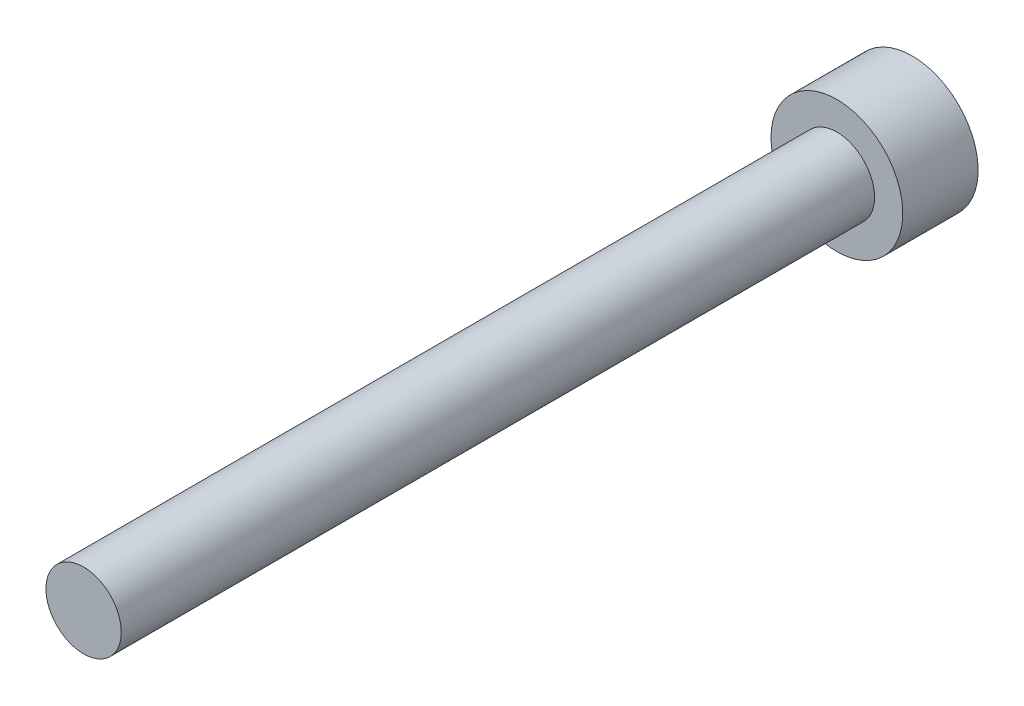
ISO-10303-21;
HEADER;
FILE_DESCRIPTION(('STEP AP214'),'2;1');
FILE_NAME('part.step','',(''),(''),'','','');
FILE_SCHEMA(('AUTOMOTIVE_DESIGN { 1 0 10303 214 1 1 1 1 }'));
ENDSEC;
DATA;
#1=APPLICATION_CONTEXT('core data for automotive mechanical design processes');
#2=APPLICATION_PROTOCOL_DEFINITION('international standard','automotive_design',2000,#1);
#3=PRODUCT_CONTEXT('',#1,'mechanical');
#4=PRODUCT('Part','Part','',(#3));
#5=PRODUCT_RELATED_PRODUCT_CATEGORY('part','',(#4));
#6=PRODUCT_DEFINITION_FORMATION('','',#4);
#7=PRODUCT_DEFINITION_CONTEXT('part definition',#1,'design');
#8=PRODUCT_DEFINITION('design','',#6,#7);
#9=PRODUCT_DEFINITION_SHAPE('','',#8);
#10=(LENGTH_UNIT() NAMED_UNIT(*) SI_UNIT(.MILLI.,.METRE.));
#11=(NAMED_UNIT(*) PLANE_ANGLE_UNIT() SI_UNIT($,.RADIAN.));
#12=(NAMED_UNIT(*) SI_UNIT($,.STERADIAN.) SOLID_ANGLE_UNIT());
#13=UNCERTAINTY_MEASURE_WITH_UNIT(LENGTH_MEASURE(1.E-05),#10,'distance_accuracy_value','');
#14=(GEOMETRIC_REPRESENTATION_CONTEXT(3) GLOBAL_UNCERTAINTY_ASSIGNED_CONTEXT((#13)) GLOBAL_UNIT_ASSIGNED_CONTEXT((#10,
#11,#12)) REPRESENTATION_CONTEXT('',''));
#15=CARTESIAN_POINT('',(0.,0.,0.));
#16=DIRECTION('',(0.,0.,1.));
#17=DIRECTION('',(1.,0.,0.));
#18=AXIS2_PLACEMENT_3D('',#15,#16,#17);
#19=CARTESIAN_POINT('',(3.5,0.,4.));
#20=DIRECTION('',(0.,0.,1.));
#21=DIRECTION('',(1.,0.,0.));
#22=AXIS2_PLACEMENT_3D('',#19,#20,#21);
#23=PLANE('',#22);
#24=CARTESIAN_POINT('',(0.,0.,4.));
#25=DIRECTION('',(0.,0.,-1.));
#26=DIRECTION('',(-1.,0.,0.));
#27=AXIS2_PLACEMENT_3D('',#24,#25,#26);
#28=CIRCLE('',#27,3.5);
#29=CARTESIAN_POINT('',(-3.5,0.,4.));
#30=VERTEX_POINT('',#29);
#31=EDGE_CURVE('E11',#30,#30,#28,.T.);
#32=ORIENTED_EDGE('',*,*,#31,.F.);
#33=EDGE_LOOP('',(#32));
#34=FACE_BOUND('',#33,.T.);
#35=CARTESIAN_POINT('',(0.,0.,4.));
#36=DIRECTION('',(0.,0.,1.));
#37=DIRECTION('',(1.,0.,0.));
#38=AXIS2_PLACEMENT_3D('',#35,#36,#37);
#39=CIRCLE('',#38,2.);
#40=CARTESIAN_POINT('',(2.,0.,4.));
#41=VERTEX_POINT('',#40);
#42=EDGE_CURVE('E140',#41,#41,#39,.T.);
#43=ORIENTED_EDGE('',*,*,#42,.F.);
#44=EDGE_LOOP('',(#43));
#45=FACE_BOUND('',#44,.T.);
#46=ADVANCED_FACE('F30',(#34,#45),#23,.T.);
#47=CARTESIAN_POINT('',(0.,0.,4.));
#48=DIRECTION('',(0.,0.,-1.));
#49=DIRECTION('',(-1.,0.,0.));
#50=AXIS2_PLACEMENT_3D('',#47,#48,#49);
#51=CYLINDRICAL_SURFACE('',#50,3.5);
#52=ORIENTED_EDGE('',*,*,#31,.T.);
#53=EDGE_LOOP('',(#52));
#54=FACE_BOUND('',#53,.T.);
#55=CARTESIAN_POINT('',(0.,0.,0.));
#56=DIRECTION('',(0.,0.,-1.));
#57=DIRECTION('',(-1.,0.,0.));
#58=AXIS2_PLACEMENT_3D('',#55,#56,#57);
#59=CIRCLE('',#58,3.5);
#60=CARTESIAN_POINT('',(-3.5,0.,0.));
#61=VERTEX_POINT('',#60);
#62=EDGE_CURVE('E38',#61,#61,#59,.T.);
#63=ORIENTED_EDGE('',*,*,#62,.F.);
#64=EDGE_LOOP('',(#63));
#65=FACE_BOUND('',#64,.T.);
#66=ADVANCED_FACE('F32',(#54,#65),#51,.T.);
#67=CARTESIAN_POINT('',(0.,0.,0.));
#68=DIRECTION('',(0.,0.,-1.));
#69=DIRECTION('',(-1.,0.,0.));
#70=AXIS2_PLACEMENT_3D('',#67,#68,#69);
#71=PLANE('',#70);
#72=DIRECTION('',(0.5,-0.866025403784439,0.));
#73=VECTOR('',#72,1.);
#74=CARTESIAN_POINT('',(0.850000000000006,1.47224318643355,0.));
#75=LINE('',#74,#73);
#76=CARTESIAN_POINT('',(0.850000000000006,1.47224318643355,0.));
#77=VERTEX_POINT('',#76);
#78=CARTESIAN_POINT('',(1.70000000000001,0.,0.));
#79=VERTEX_POINT('',#78);
#80=EDGE_CURVE('E45',#77,#79,#75,.T.);
#81=ORIENTED_EDGE('',*,*,#80,.F.);
#82=DIRECTION('',(1.,0.,0.));
#83=VECTOR('',#82,1.);
#84=CARTESIAN_POINT('',(-0.849999999999998,1.47224318643355,0.));
#85=LINE('',#84,#83);
#86=CARTESIAN_POINT('',(-0.849999999999998,1.47224318643355,0.));
#87=VERTEX_POINT('',#86);
#88=EDGE_CURVE('E128',#87,#77,#85,.T.);
#89=ORIENTED_EDGE('',*,*,#88,.F.);
#90=DIRECTION('',(0.500000000000001,0.866025403784438,0.));
#91=VECTOR('',#90,1.);
#92=CARTESIAN_POINT('',(-1.7,0.,0.));
#93=LINE('',#92,#91);
#94=CARTESIAN_POINT('',(-1.7,0.,0.));
#95=VERTEX_POINT('',#94);
#96=EDGE_CURVE('E126',#95,#87,#93,.T.);
#97=ORIENTED_EDGE('',*,*,#96,.F.);
#98=DIRECTION('',(-0.499999999999999,0.866025403784439,0.));
#99=VECTOR('',#98,1.);
#100=CARTESIAN_POINT('',(-0.849999999999999,-1.47224318643355,0.));
#101=LINE('',#100,#99);
#102=CARTESIAN_POINT('',(-0.849999999999999,-1.47224318643355,0.));
#103=VERTEX_POINT('',#102);
#104=EDGE_CURVE('E93',#103,#95,#101,.T.);
#105=ORIENTED_EDGE('',*,*,#104,.F.);
#106=DIRECTION('',(-1.,0.,0.));
#107=VECTOR('',#106,1.);
#108=CARTESIAN_POINT('',(0.850000000000003,-1.47224318643355,0.));
#109=LINE('',#108,#107);
#110=CARTESIAN_POINT('',(0.850000000000003,-1.47224318643355,0.));
#111=VERTEX_POINT('',#110);
#112=EDGE_CURVE('E122',#111,#103,#109,.T.);
#113=ORIENTED_EDGE('',*,*,#112,.F.);
#114=DIRECTION('',(-0.500000000000002,-0.866025403784438,0.));
#115=VECTOR('',#114,1.);
#116=CARTESIAN_POINT('',(1.70000000000001,0.,0.));
#117=LINE('',#116,#115);
#118=EDGE_CURVE('E119',#79,#111,#117,.T.);
#119=ORIENTED_EDGE('',*,*,#118,.F.);
#120=EDGE_LOOP('',(#81,#89,#97,#105,#113,#119));
#121=FACE_BOUND('',#120,.T.);
#122=ORIENTED_EDGE('',*,*,#62,.T.);
#123=EDGE_LOOP('',(#122));
#124=FACE_BOUND('',#123,.T.);
#125=ADVANCED_FACE('F145',(#121,#124),#71,.T.);
#126=CARTESIAN_POINT('',(0.,0.,24.));
#127=DIRECTION('',(0.,0.,-1.));
#128=DIRECTION('',(-1.,0.,0.));
#129=AXIS2_PLACEMENT_3D('',#126,#127,#128);
#130=CYLINDRICAL_SURFACE('',#129,2.);
#131=ORIENTED_EDGE('',*,*,#42,.T.);
#132=EDGE_LOOP('',(#131));
#133=FACE_BOUND('',#132,.T.);
#134=CARTESIAN_POINT('',(0.,0.,44.));
#135=DIRECTION('',(0.,0.,1.));
#136=DIRECTION('',(1.,0.,0.));
#137=AXIS2_PLACEMENT_3D('',#134,#135,#136);
#138=CIRCLE('',#137,2.);
#139=CARTESIAN_POINT('',(2.,0.,44.));
#140=VERTEX_POINT('',#139);
#141=EDGE_CURVE('E132',#140,#140,#138,.T.);
#142=ORIENTED_EDGE('',*,*,#141,.F.);
#143=EDGE_LOOP('',(#142));
#144=FACE_BOUND('',#143,.T.);
#145=ADVANCED_FACE('F153',(#133,#144),#130,.T.);
#146=CARTESIAN_POINT('',(0.,0.,44.));
#147=DIRECTION('',(0.,0.,1.));
#148=DIRECTION('',(1.,0.,0.));
#149=AXIS2_PLACEMENT_3D('',#146,#147,#148);
#150=PLANE('',#149);
#151=ORIENTED_EDGE('',*,*,#141,.T.);
#152=EDGE_LOOP('',(#151));
#153=FACE_BOUND('',#152,.T.);
#154=ADVANCED_FACE('F163',(#153),#150,.T.);
#155=CARTESIAN_POINT('',(0.850000000000006,1.47224318643355,2.4));
#156=DIRECTION('',(0.866025403784439,0.5,0.));
#157=DIRECTION('',(-0.5,0.866025403784439,0.));
#158=AXIS2_PLACEMENT_3D('',#155,#156,#157);
#159=PLANE('',#158);
#160=ORIENTED_EDGE('',*,*,#80,.T.);
#161=DIRECTION('',(0.,0.,-1.));
#162=VECTOR('',#161,1.);
#163=CARTESIAN_POINT('',(1.70000000000001,0.,2.4));
#164=LINE('',#163,#162);
#165=CARTESIAN_POINT('',(1.70000000000001,0.,2.4));
#166=VERTEX_POINT('',#165);
#167=EDGE_CURVE('E75',#166,#79,#164,.T.);
#168=ORIENTED_EDGE('',*,*,#167,.F.);
#169=DIRECTION('',(0.5,-0.866025403784439,0.));
#170=VECTOR('',#169,1.);
#171=CARTESIAN_POINT('',(0.850000000000006,1.47224318643355,2.4));
#172=LINE('',#171,#170);
#173=CARTESIAN_POINT('',(0.850000000000006,1.47224318643355,2.4));
#174=VERTEX_POINT('',#173);
#175=EDGE_CURVE('E130',#174,#166,#172,.T.);
#176=ORIENTED_EDGE('',*,*,#175,.F.);
#177=DIRECTION('',(0.,0.,-1.));
#178=VECTOR('',#177,1.);
#179=CARTESIAN_POINT('',(0.850000000000006,1.47224318643355,2.4));
#180=LINE('',#179,#178);
#181=EDGE_CURVE('E53',#174,#77,#180,.T.);
#182=ORIENTED_EDGE('',*,*,#181,.T.);
#183=EDGE_LOOP('',(#160,#168,#176,#182));
#184=FACE_BOUND('',#183,.T.);
#185=ADVANCED_FACE('F168',(#184),#159,.F.);
#186=CARTESIAN_POINT('',(-0.849999999999998,1.47224318643355,2.4));
#187=DIRECTION('',(0.,1.,0.));
#188=DIRECTION('',(-1.,0.,0.));
#189=AXIS2_PLACEMENT_3D('',#186,#187,#188);
#190=PLANE('',#189);
#191=ORIENTED_EDGE('',*,*,#88,.T.);
#192=ORIENTED_EDGE('',*,*,#181,.F.);
#193=DIRECTION('',(1.,0.,0.));
#194=VECTOR('',#193,1.);
#195=CARTESIAN_POINT('',(-0.849999999999998,1.47224318643355,2.4));
#196=LINE('',#195,#194);
#197=CARTESIAN_POINT('',(-0.849999999999998,1.47224318643355,2.4));
#198=VERTEX_POINT('',#197);
#199=EDGE_CURVE('E105',#198,#174,#196,.T.);
#200=ORIENTED_EDGE('',*,*,#199,.F.);
#201=DIRECTION('',(0.,0.,-1.));
#202=VECTOR('',#201,1.);
#203=CARTESIAN_POINT('',(-0.849999999999998,1.47224318643355,2.4));
#204=LINE('',#203,#202);
#205=EDGE_CURVE('E97',#198,#87,#204,.T.);
#206=ORIENTED_EDGE('',*,*,#205,.T.);
#207=EDGE_LOOP('',(#191,#192,#200,#206));
#208=FACE_BOUND('',#207,.T.);
#209=ADVANCED_FACE('F173',(#208),#190,.F.);
#210=CARTESIAN_POINT('',(-1.7,0.,2.4));
#211=DIRECTION('',(-0.866025403784438,0.500000000000001,0.));
#212=DIRECTION('',(-0.500000000000001,-0.866025403784438,0.));
#213=AXIS2_PLACEMENT_3D('',#210,#211,#212);
#214=PLANE('',#213);
#215=ORIENTED_EDGE('',*,*,#96,.T.);
#216=ORIENTED_EDGE('',*,*,#205,.F.);
#217=DIRECTION('',(0.500000000000001,0.866025403784438,0.));
#218=VECTOR('',#217,1.);
#219=CARTESIAN_POINT('',(-1.7,0.,2.4));
#220=LINE('',#219,#218);
#221=CARTESIAN_POINT('',(-1.7,0.,2.4));
#222=VERTEX_POINT('',#221);
#223=EDGE_CURVE('E101',#222,#198,#220,.T.);
#224=ORIENTED_EDGE('',*,*,#223,.F.);
#225=DIRECTION('',(0.,0.,-1.));
#226=VECTOR('',#225,1.);
#227=CARTESIAN_POINT('',(-1.7,0.,2.4));
#228=LINE('',#227,#226);
#229=EDGE_CURVE('E86',#222,#95,#228,.T.);
#230=ORIENTED_EDGE('',*,*,#229,.T.);
#231=EDGE_LOOP('',(#215,#216,#224,#230));
#232=FACE_BOUND('',#231,.T.);
#233=ADVANCED_FACE('F102',(#232),#214,.F.);
#234=CARTESIAN_POINT('',(-0.849999999999999,-1.47224318643355,2.4));
#235=DIRECTION('',(-0.866025403784439,-0.499999999999999,0.));
#236=DIRECTION('',(0.499999999999999,-0.866025403784439,0.));
#237=AXIS2_PLACEMENT_3D('',#234,#235,#236);
#238=PLANE('',#237);
#239=ORIENTED_EDGE('',*,*,#104,.T.);
#240=ORIENTED_EDGE('',*,*,#229,.F.);
#241=DIRECTION('',(-0.499999999999999,0.866025403784439,0.));
#242=VECTOR('',#241,1.);
#243=CARTESIAN_POINT('',(-0.849999999999999,-1.47224318643355,2.4));
#244=LINE('',#243,#242);
#245=CARTESIAN_POINT('',(-0.849999999999999,-1.47224318643355,2.4));
#246=VERTEX_POINT('',#245);
#247=EDGE_CURVE('E90',#246,#222,#244,.T.);
#248=ORIENTED_EDGE('',*,*,#247,.F.);
#249=DIRECTION('',(0.,0.,-1.));
#250=VECTOR('',#249,1.);
#251=CARTESIAN_POINT('',(-0.849999999999999,-1.47224318643355,2.4));
#252=LINE('',#251,#250);
#253=EDGE_CURVE('E98',#246,#103,#252,.T.);
#254=ORIENTED_EDGE('',*,*,#253,.T.);
#255=EDGE_LOOP('',(#239,#240,#248,#254));
#256=FACE_BOUND('',#255,.T.);
#257=ADVANCED_FACE('F88',(#256),#238,.F.);
#258=CARTESIAN_POINT('',(0.850000000000003,-1.47224318643355,2.4));
#259=DIRECTION('',(0.,-1.,0.));
#260=DIRECTION('',(1.,0.,0.));
#261=AXIS2_PLACEMENT_3D('',#258,#259,#260);
#262=PLANE('',#261);
#263=ORIENTED_EDGE('',*,*,#112,.T.);
#264=ORIENTED_EDGE('',*,*,#253,.F.);
#265=DIRECTION('',(-1.,0.,0.));
#266=VECTOR('',#265,1.);
#267=CARTESIAN_POINT('',(0.850000000000003,-1.47224318643355,2.4));
#268=LINE('',#267,#266);
#269=CARTESIAN_POINT('',(0.850000000000003,-1.47224318643355,2.4));
#270=VERTEX_POINT('',#269);
#271=EDGE_CURVE('E111',#270,#246,#268,.T.);
#272=ORIENTED_EDGE('',*,*,#271,.F.);
#273=DIRECTION('',(0.,0.,-1.));
#274=VECTOR('',#273,1.);
#275=CARTESIAN_POINT('',(0.850000000000003,-1.47224318643355,2.4));
#276=LINE('',#275,#274);
#277=EDGE_CURVE('E135',#270,#111,#276,.T.);
#278=ORIENTED_EDGE('',*,*,#277,.T.);
#279=EDGE_LOOP('',(#263,#264,#272,#278));
#280=FACE_BOUND('',#279,.T.);
#281=ADVANCED_FACE('F179',(#280),#262,.F.);
#282=CARTESIAN_POINT('',(1.70000000000001,0.,2.4));
#283=DIRECTION('',(0.866025403784438,-0.500000000000002,0.));
#284=DIRECTION('',(0.500000000000002,0.866025403784438,0.));
#285=AXIS2_PLACEMENT_3D('',#282,#283,#284);
#286=PLANE('',#285);
#287=ORIENTED_EDGE('',*,*,#118,.T.);
#288=ORIENTED_EDGE('',*,*,#277,.F.);
#289=DIRECTION('',(-0.500000000000002,-0.866025403784438,0.));
#290=VECTOR('',#289,1.);
#291=CARTESIAN_POINT('',(1.70000000000001,0.,2.4));
#292=LINE('',#291,#290);
#293=EDGE_CURVE('E113',#166,#270,#292,.T.);
#294=ORIENTED_EDGE('',*,*,#293,.F.);
#295=ORIENTED_EDGE('',*,*,#167,.T.);
#296=EDGE_LOOP('',(#287,#288,#294,#295));
#297=FACE_BOUND('',#296,.T.);
#298=ADVANCED_FACE('F176',(#297),#286,.F.);
#299=CARTESIAN_POINT('',(1.70000000000001,0.,2.4));
#300=DIRECTION('',(0.,0.,-1.));
#301=DIRECTION('',(-1.,0.,0.));
#302=AXIS2_PLACEMENT_3D('',#299,#300,#301);
#303=PLANE('',#302);
#304=ORIENTED_EDGE('',*,*,#175,.T.);
#305=ORIENTED_EDGE('',*,*,#293,.T.);
#306=ORIENTED_EDGE('',*,*,#271,.T.);
#307=ORIENTED_EDGE('',*,*,#247,.T.);
#308=ORIENTED_EDGE('',*,*,#223,.T.);
#309=ORIENTED_EDGE('',*,*,#199,.T.);
#310=EDGE_LOOP('',(#304,#305,#306,#307,#308,#309));
#311=FACE_BOUND('',#310,.T.);
#312=ADVANCED_FACE('F108',(#311),#303,.T.);
#313=CLOSED_SHELL('',(#46,#66,#125,#145,#154,#185,#209,#233,#257,#281,#298,#312));
#314=MANIFOLD_SOLID_BREP('B2',#313);
#315=ADVANCED_BREP_SHAPE_REPRESENTATION('',(#18,#314),#14);
#316=SHAPE_DEFINITION_REPRESENTATION(#9,#315);
ENDSEC;
END-ISO-10303-21;
